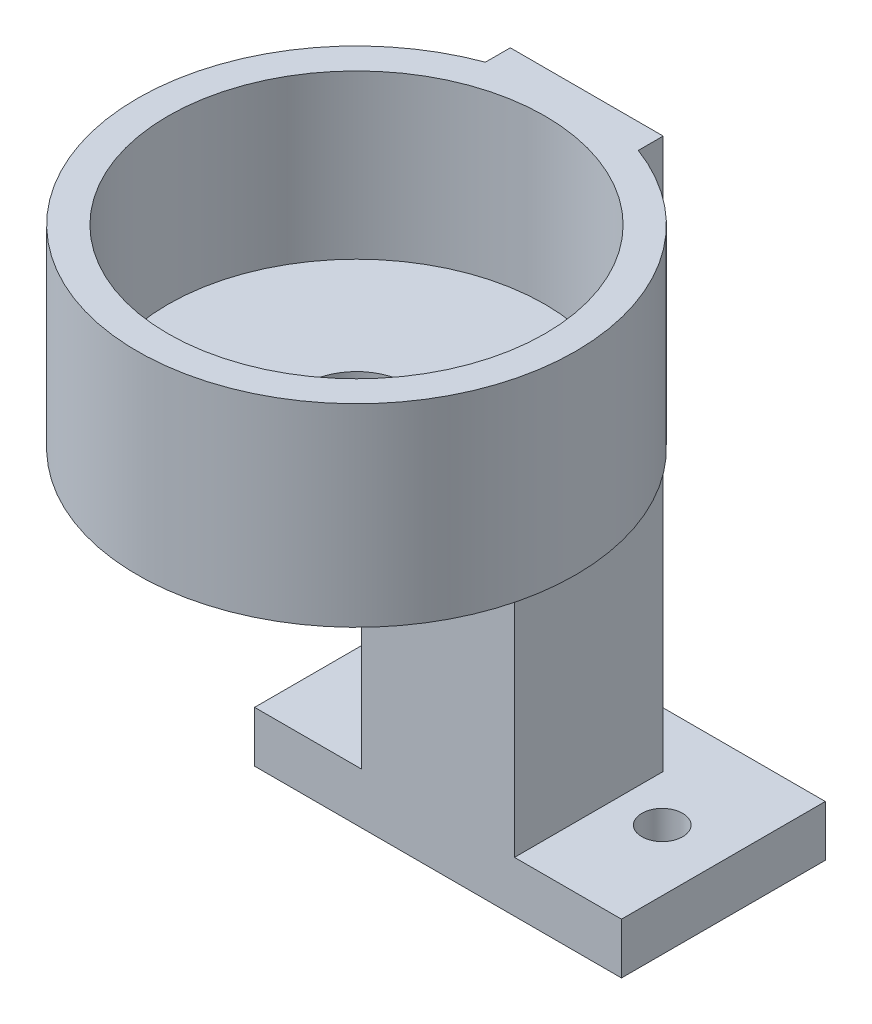
ISO-10303-21;
HEADER;
FILE_DESCRIPTION(('STEP AP214'),'2;1');
FILE_NAME('part.step','',(''),(''),'','','');
FILE_SCHEMA(('AUTOMOTIVE_DESIGN { 1 0 10303 214 1 1 1 1 }'));
ENDSEC;
DATA;
#1=APPLICATION_CONTEXT('core data for automotive mechanical design processes');
#2=APPLICATION_PROTOCOL_DEFINITION('international standard','automotive_design',2000,#1);
#3=PRODUCT_CONTEXT('',#1,'mechanical');
#4=PRODUCT('Part','Part','',(#3));
#5=PRODUCT_RELATED_PRODUCT_CATEGORY('part','',(#4));
#6=PRODUCT_DEFINITION_FORMATION('','',#4);
#7=PRODUCT_DEFINITION_CONTEXT('part definition',#1,'design');
#8=PRODUCT_DEFINITION('design','',#6,#7);
#9=PRODUCT_DEFINITION_SHAPE('','',#8);
#10=(LENGTH_UNIT() NAMED_UNIT(*) SI_UNIT(.MILLI.,.METRE.));
#11=(NAMED_UNIT(*) PLANE_ANGLE_UNIT() SI_UNIT($,.RADIAN.));
#12=(NAMED_UNIT(*) SI_UNIT($,.STERADIAN.) SOLID_ANGLE_UNIT());
#13=UNCERTAINTY_MEASURE_WITH_UNIT(LENGTH_MEASURE(1.E-05),#10,'distance_accuracy_value','');
#14=(GEOMETRIC_REPRESENTATION_CONTEXT(3) GLOBAL_UNCERTAINTY_ASSIGNED_CONTEXT((#13)) GLOBAL_UNIT_ASSIGNED_CONTEXT((#10,
#11,#12)) REPRESENTATION_CONTEXT('',''));
#15=CARTESIAN_POINT('',(0.,0.,0.));
#16=DIRECTION('',(0.,0.,1.));
#17=DIRECTION('',(1.,0.,0.));
#18=AXIS2_PLACEMENT_3D('',#15,#16,#17);
#19=CARTESIAN_POINT('',(18.,59.,8.));
#20=DIRECTION('',(0.,-1.,0.));
#21=DIRECTION('',(0.,0.,-1.));
#22=AXIS2_PLACEMENT_3D('',#19,#20,#21);
#23=CYLINDRICAL_SURFACE('',#22,21.5);
#24=CARTESIAN_POINT('',(18.,59.,8.));
#25=DIRECTION('',(0.,1.,0.));
#26=DIRECTION('',(0.,0.,1.));
#27=AXIS2_PLACEMENT_3D('',#24,#25,#26);
#28=CIRCLE('',#27,21.5);
#29=CARTESIAN_POINT('',(10.5,59.,-12.1494416796099));
#30=VERTEX_POINT('',#29);
#31=CARTESIAN_POINT('',(25.5,59.,-12.1494416796099));
#32=VERTEX_POINT('',#31);
#33=EDGE_CURVE('E157',#30,#32,#28,.T.);
#34=ORIENTED_EDGE('',*,*,#33,.F.);
#35=DIRECTION('',(0.,1.,0.));
#36=VECTOR('',#35,1.);
#37=CARTESIAN_POINT('',(10.5,40.,-12.1494416796099));
#38=LINE('',#37,#36);
#39=CARTESIAN_POINT('',(10.5,40.,-12.1494416796099));
#40=VERTEX_POINT('',#39);
#41=EDGE_CURVE('E61',#30,#40,#38,.F.);
#42=ORIENTED_EDGE('',*,*,#41,.T.);
#43=CARTESIAN_POINT('',(18.,40.,8.));
#44=DIRECTION('',(0.,1.,0.));
#45=DIRECTION('',(0.,0.,1.));
#46=AXIS2_PLACEMENT_3D('',#43,#44,#45);
#47=CIRCLE('',#46,21.5);
#48=CARTESIAN_POINT('',(25.5,40.,-12.1494416796099));
#49=VERTEX_POINT('',#48);
#50=EDGE_CURVE('E163',#40,#49,#47,.T.);
#51=ORIENTED_EDGE('',*,*,#50,.T.);
#52=DIRECTION('',(0.,1.,0.));
#53=VECTOR('',#52,1.);
#54=CARTESIAN_POINT('',(25.5,40.,-12.1494416796099));
#55=LINE('',#54,#53);
#56=EDGE_CURVE('E167',#32,#49,#55,.F.);
#57=ORIENTED_EDGE('',*,*,#56,.F.);
#58=EDGE_LOOP('',(#34,#42,#51,#57));
#59=FACE_BOUND('',#58,.T.);
#60=ADVANCED_FACE('F45',(#59),#23,.T.);
#61=CARTESIAN_POINT('',(18.,43.,8.));
#62=DIRECTION('',(0.,-1.,0.));
#63=DIRECTION('',(0.,0.,-1.));
#64=AXIS2_PLACEMENT_3D('',#61,#62,#63);
#65=CYLINDRICAL_SURFACE('',#64,7.5);
#66=CARTESIAN_POINT('',(18.,40.,8.));
#67=DIRECTION('',(0.,1.,0.));
#68=DIRECTION('',(0.,0.,1.));
#69=AXIS2_PLACEMENT_3D('',#66,#67,#68);
#70=CIRCLE('',#69,7.5);
#71=CARTESIAN_POINT('',(10.5,40.,8.));
#72=VERTEX_POINT('',#71);
#73=CARTESIAN_POINT('',(25.5,40.,8.));
#74=VERTEX_POINT('',#73);
#75=EDGE_CURVE('E11',#72,#74,#70,.T.);
#76=ORIENTED_EDGE('',*,*,#75,.F.);
#77=DIRECTION('',(0.,-1.,0.));
#78=VECTOR('',#77,1.);
#79=CARTESIAN_POINT('',(10.5,43.,8.));
#80=LINE('',#79,#78);
#81=CARTESIAN_POINT('',(10.5,37.,8.));
#82=VERTEX_POINT('',#81);
#83=EDGE_CURVE('E214',#72,#82,#80,.T.);
#84=ORIENTED_EDGE('',*,*,#83,.T.);
#85=CARTESIAN_POINT('',(18.,37.,8.));
#86=DIRECTION('',(0.,1.,0.));
#87=DIRECTION('',(0.,0.,1.));
#88=AXIS2_PLACEMENT_3D('',#85,#86,#87);
#89=CIRCLE('',#88,7.5);
#90=CARTESIAN_POINT('',(25.5,37.,8.));
#91=VERTEX_POINT('',#90);
#92=EDGE_CURVE('E201',#82,#91,#89,.T.);
#93=ORIENTED_EDGE('',*,*,#92,.T.);
#94=DIRECTION('',(0.,-1.,0.));
#95=VECTOR('',#94,1.);
#96=CARTESIAN_POINT('',(25.5,43.,8.));
#97=LINE('',#96,#95);
#98=EDGE_CURVE('E196',#74,#91,#97,.T.);
#99=ORIENTED_EDGE('',*,*,#98,.F.);
#100=EDGE_LOOP('',(#76,#84,#93,#99));
#101=FACE_BOUND('',#100,.T.);
#102=ADVANCED_FACE('F308',(#101),#65,.T.);
#103=CARTESIAN_POINT('',(0.,43.,0.));
#104=DIRECTION('',(0.,1.,0.));
#105=DIRECTION('',(0.,0.,1.));
#106=AXIS2_PLACEMENT_3D('',#103,#104,#105);
#107=PLANE('',#106);
#108=CARTESIAN_POINT('',(18.,43.,8.));
#109=DIRECTION('',(0.,1.,0.));
#110=DIRECTION('',(0.,0.,1.));
#111=AXIS2_PLACEMENT_3D('',#108,#109,#110);
#112=CIRCLE('',#111,18.5);
#113=CARTESIAN_POINT('',(18.,43.,26.5));
#114=VERTEX_POINT('',#113);
#115=EDGE_CURVE('E181',#114,#114,#112,.T.);
#116=ORIENTED_EDGE('',*,*,#115,.T.);
#117=EDGE_LOOP('',(#116));
#118=FACE_BOUND('',#117,.T.);
#119=CARTESIAN_POINT('',(18.,43.,8.));
#120=DIRECTION('',(0.,1.,0.));
#121=DIRECTION('',(0.,0.,1.));
#122=AXIS2_PLACEMENT_3D('',#119,#120,#121);
#123=CIRCLE('',#122,5.);
#124=CARTESIAN_POINT('',(18.,43.,13.));
#125=VERTEX_POINT('',#124);
#126=EDGE_CURVE('E192',#125,#125,#123,.T.);
#127=ORIENTED_EDGE('',*,*,#126,.F.);
#128=EDGE_LOOP('',(#127));
#129=FACE_BOUND('',#128,.T.);
#130=ADVANCED_FACE('F359',(#118,#129),#107,.T.);
#131=CARTESIAN_POINT('',(0.,5.,0.));
#132=DIRECTION('',(1.,0.,0.));
#133=DIRECTION('',(0.,0.,-1.));
#134=AXIS2_PLACEMENT_3D('',#131,#132,#133);
#135=PLANE('',#134);
#136=DIRECTION('',(0.,0.,1.));
#137=VECTOR('',#136,1.);
#138=CARTESIAN_POINT('',(0.,0.,0.));
#139=LINE('',#138,#137);
#140=CARTESIAN_POINT('',(0.,0.,-20.));
#141=VERTEX_POINT('',#140);
#142=CARTESIAN_POINT('',(0.,0.,0.));
#143=VERTEX_POINT('',#142);
#144=EDGE_CURVE('E230',#141,#143,#139,.T.);
#145=ORIENTED_EDGE('',*,*,#144,.T.);
#146=DIRECTION('',(0.,-1.,0.));
#147=VECTOR('',#146,1.);
#148=CARTESIAN_POINT('',(0.,5.,0.));
#149=LINE('',#148,#147);
#150=CARTESIAN_POINT('',(0.,5.,0.));
#151=VERTEX_POINT('',#150);
#152=EDGE_CURVE('E54',#151,#143,#149,.T.);
#153=ORIENTED_EDGE('',*,*,#152,.F.);
#154=DIRECTION('',(0.,0.,1.));
#155=VECTOR('',#154,1.);
#156=CARTESIAN_POINT('',(0.,5.,0.));
#157=LINE('',#156,#155);
#158=CARTESIAN_POINT('',(0.,5.,-20.));
#159=VERTEX_POINT('',#158);
#160=EDGE_CURVE('E237',#159,#151,#157,.T.);
#161=ORIENTED_EDGE('',*,*,#160,.F.);
#162=DIRECTION('',(0.,-1.,0.));
#163=VECTOR('',#162,1.);
#164=CARTESIAN_POINT('',(0.,5.,-20.));
#165=LINE('',#164,#163);
#166=EDGE_CURVE('E252',#159,#141,#165,.T.);
#167=ORIENTED_EDGE('',*,*,#166,.T.);
#168=EDGE_LOOP('',(#145,#153,#161,#167));
#169=FACE_BOUND('',#168,.T.);
#170=ADVANCED_FACE('F47',(#169),#135,.F.);
#171=CARTESIAN_POINT('',(0.,5.,0.));
#172=DIRECTION('',(0.,0.,-1.));
#173=DIRECTION('',(-1.,0.,0.));
#174=AXIS2_PLACEMENT_3D('',#171,#172,#173);
#175=PLANE('',#174);
#176=DIRECTION('',(1.,0.,0.));
#177=VECTOR('',#176,1.);
#178=CARTESIAN_POINT('',(0.,0.,0.));
#179=LINE('',#178,#177);
#180=CARTESIAN_POINT('',(36.,0.,0.));
#181=VERTEX_POINT('',#180);
#182=EDGE_CURVE('E256',#143,#181,#179,.T.);
#183=ORIENTED_EDGE('',*,*,#182,.T.);
#184=DIRECTION('',(0.,-1.,0.));
#185=VECTOR('',#184,1.);
#186=CARTESIAN_POINT('',(36.,5.,0.));
#187=LINE('',#186,#185);
#188=CARTESIAN_POINT('',(36.,5.,0.));
#189=VERTEX_POINT('',#188);
#190=EDGE_CURVE('E271',#189,#181,#187,.T.);
#191=ORIENTED_EDGE('',*,*,#190,.F.);
#192=DIRECTION('',(1.,0.,0.));
#193=VECTOR('',#192,1.);
#194=CARTESIAN_POINT('',(0.,5.,0.));
#195=LINE('',#194,#193);
#196=CARTESIAN_POINT('',(25.5,5.,0.));
#197=VERTEX_POINT('',#196);
#198=EDGE_CURVE('E241',#197,#189,#195,.T.);
#199=ORIENTED_EDGE('',*,*,#198,.F.);
#200=DIRECTION('',(0.,-1.,0.));
#201=VECTOR('',#200,1.);
#202=CARTESIAN_POINT('',(25.5,37.,0.));
#203=LINE('',#202,#201);
#204=CARTESIAN_POINT('',(25.5,37.,0.));
#205=VERTEX_POINT('',#204);
#206=EDGE_CURVE('E221',#205,#197,#203,.T.);
#207=ORIENTED_EDGE('',*,*,#206,.F.);
#208=DIRECTION('',(1.,0.,0.));
#209=VECTOR('',#208,1.);
#210=CARTESIAN_POINT('',(10.5,37.,0.));
#211=LINE('',#210,#209);
#212=CARTESIAN_POINT('',(10.5,37.,0.));
#213=VERTEX_POINT('',#212);
#214=EDGE_CURVE('E217',#213,#205,#211,.T.);
#215=ORIENTED_EDGE('',*,*,#214,.F.);
#216=DIRECTION('',(0.,-1.,0.));
#217=VECTOR('',#216,1.);
#218=CARTESIAN_POINT('',(10.5,37.,0.));
#219=LINE('',#218,#217);
#220=CARTESIAN_POINT('',(10.5,5.,0.));
#221=VERTEX_POINT('',#220);
#222=EDGE_CURVE('E226',#213,#221,#219,.T.);
#223=ORIENTED_EDGE('',*,*,#222,.T.);
#224=EDGE_CURVE('E243',#151,#221,#195,.T.);
#225=ORIENTED_EDGE('',*,*,#224,.F.);
#226=ORIENTED_EDGE('',*,*,#152,.T.);
#227=EDGE_LOOP('',(#183,#191,#199,#207,#215,#223,#225,#226));
#228=FACE_BOUND('',#227,.T.);
#229=ADVANCED_FACE('F278',(#228),#175,.F.);
#230=CARTESIAN_POINT('',(36.,5.,0.));
#231=DIRECTION('',(-1.,0.,0.));
#232=DIRECTION('',(0.,0.,1.));
#233=AXIS2_PLACEMENT_3D('',#230,#231,#232);
#234=PLANE('',#233);
#235=DIRECTION('',(0.,0.,-1.));
#236=VECTOR('',#235,1.);
#237=CARTESIAN_POINT('',(36.,0.,0.));
#238=LINE('',#237,#236);
#239=CARTESIAN_POINT('',(36.,0.,-20.));
#240=VERTEX_POINT('',#239);
#241=EDGE_CURVE('E259',#181,#240,#238,.T.);
#242=ORIENTED_EDGE('',*,*,#241,.T.);
#243=DIRECTION('',(0.,-1.,0.));
#244=VECTOR('',#243,1.);
#245=CARTESIAN_POINT('',(36.,5.,-20.));
#246=LINE('',#245,#244);
#247=CARTESIAN_POINT('',(36.,5.,-20.));
#248=VERTEX_POINT('',#247);
#249=EDGE_CURVE('E267',#248,#240,#246,.T.);
#250=ORIENTED_EDGE('',*,*,#249,.F.);
#251=DIRECTION('',(0.,0.,-1.));
#252=VECTOR('',#251,1.);
#253=CARTESIAN_POINT('',(36.,5.,0.));
#254=LINE('',#253,#252);
#255=EDGE_CURVE('E246',#189,#248,#254,.T.);
#256=ORIENTED_EDGE('',*,*,#255,.F.);
#257=ORIENTED_EDGE('',*,*,#190,.T.);
#258=EDGE_LOOP('',(#242,#250,#256,#257));
#259=FACE_BOUND('',#258,.T.);
#260=ADVANCED_FACE('F290',(#259),#234,.F.);
#261=CARTESIAN_POINT('',(0.,5.,-20.));
#262=DIRECTION('',(0.,0.,1.));
#263=DIRECTION('',(1.,0.,0.));
#264=AXIS2_PLACEMENT_3D('',#261,#262,#263);
#265=PLANE('',#264);
#266=DIRECTION('',(-1.,0.,0.));
#267=VECTOR('',#266,1.);
#268=CARTESIAN_POINT('',(0.,0.,-20.));
#269=LINE('',#268,#267);
#270=EDGE_CURVE('E242',#240,#141,#269,.T.);
#271=ORIENTED_EDGE('',*,*,#270,.T.);
#272=ORIENTED_EDGE('',*,*,#166,.F.);
#273=DIRECTION('',(-1.,0.,0.));
#274=VECTOR('',#273,1.);
#275=CARTESIAN_POINT('',(0.,5.,-20.));
#276=LINE('',#275,#274);
#277=EDGE_CURVE('E249',#248,#159,#276,.T.);
#278=ORIENTED_EDGE('',*,*,#277,.F.);
#279=ORIENTED_EDGE('',*,*,#249,.T.);
#280=EDGE_LOOP('',(#271,#272,#278,#279));
#281=FACE_BOUND('',#280,.T.);
#282=ADVANCED_FACE('F294',(#281),#265,.F.);
#283=CARTESIAN_POINT('',(0.,5.,0.));
#284=DIRECTION('',(0.,-1.,0.));
#285=DIRECTION('',(0.,0.,-1.));
#286=AXIS2_PLACEMENT_3D('',#283,#284,#285);
#287=PLANE('',#286);
#288=CARTESIAN_POINT('',(6.,5.,-10.));
#289=DIRECTION('',(0.,-1.,0.));
#290=DIRECTION('',(0.,0.,-1.));
#291=AXIS2_PLACEMENT_3D('',#288,#289,#290);
#292=CIRCLE('',#291,2.);
#293=CARTESIAN_POINT('',(6.,5.,-12.));
#294=VERTEX_POINT('',#293);
#295=EDGE_CURVE('E312',#294,#294,#292,.T.);
#296=ORIENTED_EDGE('',*,*,#295,.T.);
#297=EDGE_LOOP('',(#296));
#298=FACE_BOUND('',#297,.T.);
#299=CARTESIAN_POINT('',(30.,5.,-10.));
#300=DIRECTION('',(0.,-1.,0.));
#301=DIRECTION('',(0.,0.,-1.));
#302=AXIS2_PLACEMENT_3D('',#299,#300,#301);
#303=CIRCLE('',#302,2.);
#304=CARTESIAN_POINT('',(30.,5.,-12.));
#305=VERTEX_POINT('',#304);
#306=EDGE_CURVE('E315',#305,#305,#303,.T.);
#307=ORIENTED_EDGE('',*,*,#306,.T.);
#308=EDGE_LOOP('',(#307));
#309=FACE_BOUND('',#308,.T.);
#310=ORIENTED_EDGE('',*,*,#224,.T.);
#311=DIRECTION('',(0.,0.,-1.));
#312=VECTOR('',#311,1.);
#313=CARTESIAN_POINT('',(10.5,5.,0.));
#314=LINE('',#313,#312);
#315=CARTESIAN_POINT('',(10.5,5.,-14.5912084576006));
#316=VERTEX_POINT('',#315);
#317=EDGE_CURVE('E69',#221,#316,#314,.T.);
#318=ORIENTED_EDGE('',*,*,#317,.T.);
#319=DIRECTION('',(1.,0.,0.));
#320=VECTOR('',#319,1.);
#321=CARTESIAN_POINT('',(10.5,5.,-14.5912084576006));
#322=LINE('',#321,#320);
#323=CARTESIAN_POINT('',(25.5,5.,-14.5912084576006));
#324=VERTEX_POINT('',#323);
#325=EDGE_CURVE('E149',#316,#324,#322,.T.);
#326=ORIENTED_EDGE('',*,*,#325,.T.);
#327=DIRECTION('',(0.,0.,-1.));
#328=VECTOR('',#327,1.);
#329=CARTESIAN_POINT('',(25.5,5.,0.));
#330=LINE('',#329,#328);
#331=EDGE_CURVE('E143',#197,#324,#330,.T.);
#332=ORIENTED_EDGE('',*,*,#331,.F.);
#333=ORIENTED_EDGE('',*,*,#198,.T.);
#334=ORIENTED_EDGE('',*,*,#255,.T.);
#335=ORIENTED_EDGE('',*,*,#277,.T.);
#336=ORIENTED_EDGE('',*,*,#160,.T.);
#337=EDGE_LOOP('',(#310,#318,#326,#332,#333,#334,#335,#336));
#338=FACE_BOUND('',#337,.T.);
#339=ADVANCED_FACE('F295',(#298,#309,#338),#287,.F.);
#340=CARTESIAN_POINT('',(0.,0.,0.));
#341=DIRECTION('',(0.,-1.,0.));
#342=DIRECTION('',(0.,0.,-1.));
#343=AXIS2_PLACEMENT_3D('',#340,#341,#342);
#344=PLANE('',#343);
#345=CARTESIAN_POINT('',(6.,0.,-10.));
#346=DIRECTION('',(0.,-1.,0.));
#347=DIRECTION('',(0.,0.,-1.));
#348=AXIS2_PLACEMENT_3D('',#345,#346,#347);
#349=CIRCLE('',#348,2.);
#350=CARTESIAN_POINT('',(6.,0.,-12.));
#351=VERTEX_POINT('',#350);
#352=EDGE_CURVE('E321',#351,#351,#349,.T.);
#353=ORIENTED_EDGE('',*,*,#352,.F.);
#354=EDGE_LOOP('',(#353));
#355=FACE_BOUND('',#354,.T.);
#356=CARTESIAN_POINT('',(30.,0.,-10.));
#357=DIRECTION('',(0.,-1.,0.));
#358=DIRECTION('',(0.,0.,-1.));
#359=AXIS2_PLACEMENT_3D('',#356,#357,#358);
#360=CIRCLE('',#359,2.);
#361=CARTESIAN_POINT('',(30.,0.,-12.));
#362=VERTEX_POINT('',#361);
#363=EDGE_CURVE('E322',#362,#362,#360,.T.);
#364=ORIENTED_EDGE('',*,*,#363,.F.);
#365=EDGE_LOOP('',(#364));
#366=FACE_BOUND('',#365,.T.);
#367=ORIENTED_EDGE('',*,*,#144,.F.);
#368=ORIENTED_EDGE('',*,*,#270,.F.);
#369=ORIENTED_EDGE('',*,*,#241,.F.);
#370=ORIENTED_EDGE('',*,*,#182,.F.);
#371=EDGE_LOOP('',(#367,#368,#369,#370));
#372=FACE_BOUND('',#371,.T.);
#373=ADVANCED_FACE('F286',(#355,#366,#372),#344,.T.);
#374=CARTESIAN_POINT('',(10.5,37.,0.));
#375=DIRECTION('',(-1.,0.,0.));
#376=DIRECTION('',(0.,0.,1.));
#377=AXIS2_PLACEMENT_3D('',#374,#375,#376);
#378=PLANE('',#377);
#379=ORIENTED_EDGE('',*,*,#41,.F.);
#380=DIRECTION('',(0.,0.,1.));
#381=VECTOR('',#380,1.);
#382=CARTESIAN_POINT('',(10.5,59.,-14.5912084576006));
#383=LINE('',#382,#381);
#384=CARTESIAN_POINT('',(10.5,59.,-14.5912084576006));
#385=VERTEX_POINT('',#384);
#386=EDGE_CURVE('E159',#385,#30,#383,.T.);
#387=ORIENTED_EDGE('',*,*,#386,.F.);
#388=DIRECTION('',(0.,-1.,0.));
#389=VECTOR('',#388,1.);
#390=CARTESIAN_POINT('',(10.5,37.,-14.5912084576006));
#391=LINE('',#390,#389);
#392=EDGE_CURVE('E148',#385,#316,#391,.T.);
#393=ORIENTED_EDGE('',*,*,#392,.T.);
#394=ORIENTED_EDGE('',*,*,#317,.F.);
#395=ORIENTED_EDGE('',*,*,#222,.F.);
#396=DIRECTION('',(0.,0.,1.));
#397=VECTOR('',#396,1.);
#398=CARTESIAN_POINT('',(10.5,37.,0.));
#399=LINE('',#398,#397);
#400=EDGE_CURVE('E188',#213,#82,#399,.T.);
#401=ORIENTED_EDGE('',*,*,#400,.T.);
#402=ORIENTED_EDGE('',*,*,#83,.F.);
#403=DIRECTION('',(0.,0.,-1.));
#404=VECTOR('',#403,1.);
#405=CARTESIAN_POINT('',(10.5,40.,0.));
#406=LINE('',#405,#404);
#407=EDGE_CURVE('E178',#72,#40,#406,.T.);
#408=ORIENTED_EDGE('',*,*,#407,.T.);
#409=EDGE_LOOP('',(#379,#387,#393,#394,#395,#401,#402,#408));
#410=FACE_BOUND('',#409,.T.);
#411=ADVANCED_FACE('F310',(#410),#378,.T.);
#412=CARTESIAN_POINT('',(25.5,37.,0.));
#413=DIRECTION('',(-1.,0.,0.));
#414=DIRECTION('',(0.,0.,1.));
#415=AXIS2_PLACEMENT_3D('',#412,#413,#414);
#416=PLANE('',#415);
#417=DIRECTION('',(0.,-1.,0.));
#418=VECTOR('',#417,1.);
#419=CARTESIAN_POINT('',(25.5,37.,-14.5912084576006));
#420=LINE('',#419,#418);
#421=CARTESIAN_POINT('',(25.5,59.,-14.5912084576006));
#422=VERTEX_POINT('',#421);
#423=EDGE_CURVE('E136',#422,#324,#420,.T.);
#424=ORIENTED_EDGE('',*,*,#423,.F.);
#425=DIRECTION('',(0.,0.,-1.));
#426=VECTOR('',#425,1.);
#427=CARTESIAN_POINT('',(25.5,59.,-14.5912084576006));
#428=LINE('',#427,#426);
#429=EDGE_CURVE('E140',#32,#422,#428,.T.);
#430=ORIENTED_EDGE('',*,*,#429,.F.);
#431=ORIENTED_EDGE('',*,*,#56,.T.);
#432=DIRECTION('',(0.,0.,-1.));
#433=VECTOR('',#432,1.);
#434=CARTESIAN_POINT('',(25.5,40.,0.));
#435=LINE('',#434,#433);
#436=EDGE_CURVE('E175',#74,#49,#435,.T.);
#437=ORIENTED_EDGE('',*,*,#436,.F.);
#438=ORIENTED_EDGE('',*,*,#98,.T.);
#439=DIRECTION('',(0.,0.,1.));
#440=VECTOR('',#439,1.);
#441=CARTESIAN_POINT('',(25.5,37.,0.));
#442=LINE('',#441,#440);
#443=EDGE_CURVE('E205',#205,#91,#442,.T.);
#444=ORIENTED_EDGE('',*,*,#443,.F.);
#445=ORIENTED_EDGE('',*,*,#206,.T.);
#446=ORIENTED_EDGE('',*,*,#331,.T.);
#447=EDGE_LOOP('',(#424,#430,#431,#437,#438,#444,#445,#446));
#448=FACE_BOUND('',#447,.T.);
#449=ADVANCED_FACE('F138',(#448),#416,.F.);
#450=CARTESIAN_POINT('',(10.5,37.,-14.5912084576006));
#451=DIRECTION('',(0.,0.,-1.));
#452=DIRECTION('',(-1.,0.,0.));
#453=AXIS2_PLACEMENT_3D('',#450,#451,#452);
#454=PLANE('',#453);
#455=ORIENTED_EDGE('',*,*,#325,.F.);
#456=ORIENTED_EDGE('',*,*,#392,.F.);
#457=DIRECTION('',(-1.,0.,0.));
#458=VECTOR('',#457,1.);
#459=CARTESIAN_POINT('',(10.5,59.,-14.5912084576006));
#460=LINE('',#459,#458);
#461=EDGE_CURVE('E155',#422,#385,#460,.T.);
#462=ORIENTED_EDGE('',*,*,#461,.F.);
#463=ORIENTED_EDGE('',*,*,#423,.T.);
#464=EDGE_LOOP('',(#455,#456,#462,#463));
#465=FACE_BOUND('',#464,.T.);
#466=ADVANCED_FACE('F161',(#465),#454,.T.);
#467=CARTESIAN_POINT('',(0.,37.,0.));
#468=DIRECTION('',(0.,1.,0.));
#469=DIRECTION('',(0.,0.,1.));
#470=AXIS2_PLACEMENT_3D('',#467,#468,#469);
#471=PLANE('',#470);
#472=CARTESIAN_POINT('',(18.,37.,8.));
#473=DIRECTION('',(0.,1.,0.));
#474=DIRECTION('',(0.,0.,1.));
#475=AXIS2_PLACEMENT_3D('',#472,#473,#474);
#476=CIRCLE('',#475,5.);
#477=CARTESIAN_POINT('',(18.,37.,13.));
#478=VERTEX_POINT('',#477);
#479=EDGE_CURVE('E197',#478,#478,#476,.T.);
#480=ORIENTED_EDGE('',*,*,#479,.T.);
#481=EDGE_LOOP('',(#480));
#482=FACE_BOUND('',#481,.T.);
#483=ORIENTED_EDGE('',*,*,#400,.F.);
#484=ORIENTED_EDGE('',*,*,#214,.T.);
#485=ORIENTED_EDGE('',*,*,#443,.T.);
#486=ORIENTED_EDGE('',*,*,#92,.F.);
#487=EDGE_LOOP('',(#483,#484,#485,#486));
#488=FACE_BOUND('',#487,.T.);
#489=ADVANCED_FACE('F305',(#482,#488),#471,.F.);
#490=CARTESIAN_POINT('',(18.,43.,8.));
#491=DIRECTION('',(0.,-1.,0.));
#492=DIRECTION('',(0.,0.,-1.));
#493=AXIS2_PLACEMENT_3D('',#490,#491,#492);
#494=CYLINDRICAL_SURFACE('',#493,5.);
#495=ORIENTED_EDGE('',*,*,#126,.T.);
#496=EDGE_LOOP('',(#495));
#497=FACE_BOUND('',#496,.T.);
#498=ORIENTED_EDGE('',*,*,#479,.F.);
#499=EDGE_LOOP('',(#498));
#500=FACE_BOUND('',#499,.T.);
#501=ADVANCED_FACE('F367',(#497,#500),#494,.F.);
#502=CARTESIAN_POINT('',(18.,59.,8.));
#503=DIRECTION('',(0.,-1.,0.));
#504=DIRECTION('',(0.,0.,-1.));
#505=AXIS2_PLACEMENT_3D('',#502,#503,#504);
#506=CYLINDRICAL_SURFACE('',#505,18.5);
#507=CARTESIAN_POINT('',(18.,59.,8.));
#508=DIRECTION('',(0.,1.,0.));
#509=DIRECTION('',(0.,0.,1.));
#510=AXIS2_PLACEMENT_3D('',#507,#508,#509);
#511=CIRCLE('',#510,18.5);
#512=CARTESIAN_POINT('',(18.,59.,26.5));
#513=VERTEX_POINT('',#512);
#514=EDGE_CURVE('E182',#513,#513,#511,.T.);
#515=ORIENTED_EDGE('',*,*,#514,.T.);
#516=EDGE_LOOP('',(#515));
#517=FACE_BOUND('',#516,.T.);
#518=ORIENTED_EDGE('',*,*,#115,.F.);
#519=EDGE_LOOP('',(#518));
#520=FACE_BOUND('',#519,.T.);
#521=ADVANCED_FACE('F364',(#517,#520),#506,.F.);
#522=CARTESIAN_POINT('',(0.,59.,0.));
#523=DIRECTION('',(0.,1.,0.));
#524=DIRECTION('',(0.,0.,1.));
#525=AXIS2_PLACEMENT_3D('',#522,#523,#524);
#526=PLANE('',#525);
#527=ORIENTED_EDGE('',*,*,#33,.T.);
#528=ORIENTED_EDGE('',*,*,#429,.T.);
#529=ORIENTED_EDGE('',*,*,#461,.T.);
#530=ORIENTED_EDGE('',*,*,#386,.T.);
#531=EDGE_LOOP('',(#527,#528,#529,#530));
#532=FACE_BOUND('',#531,.T.);
#533=ORIENTED_EDGE('',*,*,#514,.F.);
#534=EDGE_LOOP('',(#533));
#535=FACE_BOUND('',#534,.T.);
#536=ADVANCED_FACE('F153',(#532,#535),#526,.T.);
#537=CARTESIAN_POINT('',(18.,40.,8.));
#538=DIRECTION('',(0.,1.,0.));
#539=DIRECTION('',(0.,0.,1.));
#540=AXIS2_PLACEMENT_3D('',#537,#538,#539);
#541=PLANE('',#540);
#542=ORIENTED_EDGE('',*,*,#407,.F.);
#543=ORIENTED_EDGE('',*,*,#75,.T.);
#544=ORIENTED_EDGE('',*,*,#436,.T.);
#545=ORIENTED_EDGE('',*,*,#50,.F.);
#546=EDGE_LOOP('',(#542,#543,#544,#545));
#547=FACE_BOUND('',#546,.T.);
#548=ADVANCED_FACE('F341',(#547),#541,.F.);
#549=CARTESIAN_POINT('',(30.,16.,-10.));
#550=DIRECTION('',(0.,-1.,0.));
#551=DIRECTION('',(0.,0.,-1.));
#552=AXIS2_PLACEMENT_3D('',#549,#550,#551);
#553=CYLINDRICAL_SURFACE('',#552,2.);
#554=ORIENTED_EDGE('',*,*,#363,.T.);
#555=EDGE_LOOP('',(#554));
#556=FACE_BOUND('',#555,.T.);
#557=ORIENTED_EDGE('',*,*,#306,.F.);
#558=EDGE_LOOP('',(#557));
#559=FACE_BOUND('',#558,.T.);
#560=ADVANCED_FACE('F338',(#556,#559),#553,.F.);
#561=CARTESIAN_POINT('',(6.,16.,-10.));
#562=DIRECTION('',(0.,-1.,0.));
#563=DIRECTION('',(0.,0.,-1.));
#564=AXIS2_PLACEMENT_3D('',#561,#562,#563);
#565=CYLINDRICAL_SURFACE('',#564,2.);
#566=ORIENTED_EDGE('',*,*,#352,.T.);
#567=EDGE_LOOP('',(#566));
#568=FACE_BOUND('',#567,.T.);
#569=ORIENTED_EDGE('',*,*,#295,.F.);
#570=EDGE_LOOP('',(#569));
#571=FACE_BOUND('',#570,.T.);
#572=ADVANCED_FACE('F330',(#568,#571),#565,.F.);
#573=CLOSED_SHELL('',(#60,#102,#130,#170,#229,#260,#282,#339,#373,#411,#449,#466,#489,#501,#521,
#536,#548,#560,#572));
#574=MANIFOLD_SOLID_BREP('B2',#573);
#575=ADVANCED_BREP_SHAPE_REPRESENTATION('',(#18,#574),#14);
#576=SHAPE_DEFINITION_REPRESENTATION(#9,#575);
ENDSEC;
END-ISO-10303-21;
